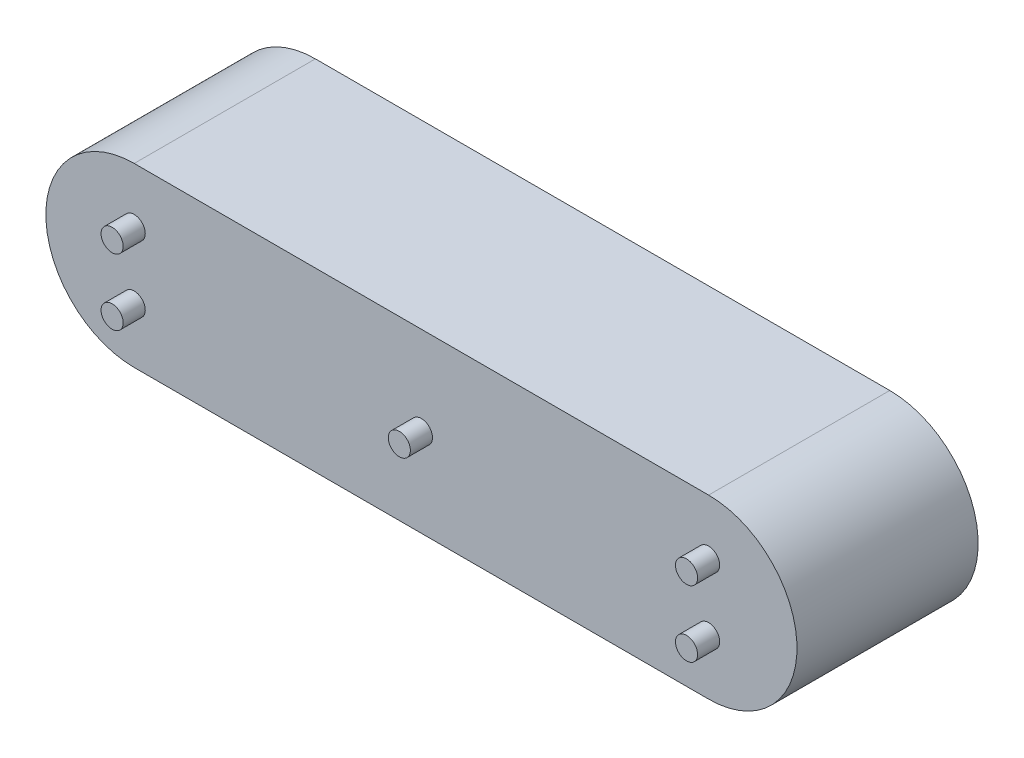
ISO-10303-21;
HEADER;
FILE_DESCRIPTION(('STEP AP214'),'2;1');
FILE_NAME('part.step','',(''),(''),'','','');
FILE_SCHEMA(('AUTOMOTIVE_DESIGN { 1 0 10303 214 1 1 1 1 }'));
ENDSEC;
DATA;
#1=APPLICATION_CONTEXT('core data for automotive mechanical design processes');
#2=APPLICATION_PROTOCOL_DEFINITION('international standard','automotive_design',2000,#1);
#3=PRODUCT_CONTEXT('',#1,'mechanical');
#4=PRODUCT('Part','Part','',(#3));
#5=PRODUCT_RELATED_PRODUCT_CATEGORY('part','',(#4));
#6=PRODUCT_DEFINITION_FORMATION('','',#4);
#7=PRODUCT_DEFINITION_CONTEXT('part definition',#1,'design');
#8=PRODUCT_DEFINITION('design','',#6,#7);
#9=PRODUCT_DEFINITION_SHAPE('','',#8);
#10=(LENGTH_UNIT() NAMED_UNIT(*) SI_UNIT(.MILLI.,.METRE.));
#11=(NAMED_UNIT(*) PLANE_ANGLE_UNIT() SI_UNIT($,.RADIAN.));
#12=(NAMED_UNIT(*) SI_UNIT($,.STERADIAN.) SOLID_ANGLE_UNIT());
#13=UNCERTAINTY_MEASURE_WITH_UNIT(LENGTH_MEASURE(1.E-05),#10,'distance_accuracy_value','');
#14=(GEOMETRIC_REPRESENTATION_CONTEXT(3) GLOBAL_UNCERTAINTY_ASSIGNED_CONTEXT((#13)) GLOBAL_UNIT_ASSIGNED_CONTEXT((#10,
#11,#12)) REPRESENTATION_CONTEXT('',''));
#15=CARTESIAN_POINT('',(0.,0.,0.));
#16=DIRECTION('',(0.,0.,1.));
#17=DIRECTION('',(1.,0.,0.));
#18=AXIS2_PLACEMENT_3D('',#15,#16,#17);
#19=CARTESIAN_POINT('',(0.,0.,-46.));
#20=DIRECTION('',(0.,0.,1.));
#21=DIRECTION('',(1.,0.,0.));
#22=AXIS2_PLACEMENT_3D('',#19,#20,#21);
#23=CYLINDRICAL_SURFACE('',#22,2.5);
#24=CARTESIAN_POINT('',(0.,0.,-46.));
#25=DIRECTION('',(0.,0.,1.));
#26=DIRECTION('',(1.,0.,0.));
#27=AXIS2_PLACEMENT_3D('',#24,#25,#26);
#28=CIRCLE('',#27,2.5);
#29=CARTESIAN_POINT('',(2.5,0.,-46.));
#30=VERTEX_POINT('',#29);
#31=EDGE_CURVE('E119',#30,#30,#28,.T.);
#32=ORIENTED_EDGE('',*,*,#31,.T.);
#33=EDGE_LOOP('',(#32));
#34=FACE_BOUND('',#33,.T.);
#35=CARTESIAN_POINT('',(0.,0.,-41.));
#36=DIRECTION('',(0.,0.,1.));
#37=DIRECTION('',(1.,0.,0.));
#38=AXIS2_PLACEMENT_3D('',#35,#36,#37);
#39=CIRCLE('',#38,2.5);
#40=CARTESIAN_POINT('',(2.5,0.,-41.));
#41=VERTEX_POINT('',#40);
#42=EDGE_CURVE('E113',#41,#41,#39,.F.);
#43=ORIENTED_EDGE('',*,*,#42,.T.);
#44=EDGE_LOOP('',(#43));
#45=FACE_BOUND('',#44,.T.);
#46=ADVANCED_FACE('F34',(#34,#45),#23,.T.);
#47=CARTESIAN_POINT('',(0.,0.,-46.));
#48=DIRECTION('',(0.,0.,1.));
#49=DIRECTION('',(1.,0.,0.));
#50=AXIS2_PLACEMENT_3D('',#47,#48,#49);
#51=PLANE('',#50);
#52=ORIENTED_EDGE('',*,*,#31,.F.);
#53=EDGE_LOOP('',(#52));
#54=FACE_BOUND('',#53,.T.);
#55=ADVANCED_FACE('F159',(#54),#51,.F.);
#56=CARTESIAN_POINT('',(-130.,7.49999999999999,-41.));
#57=DIRECTION('',(0.,0.,1.));
#58=DIRECTION('',(1.,0.,0.));
#59=AXIS2_PLACEMENT_3D('',#56,#57,#58);
#60=CYLINDRICAL_SURFACE('',#59,20.);
#61=CARTESIAN_POINT('',(-130.,7.49999999999999,0.));
#62=DIRECTION('',(0.,0.,1.));
#63=DIRECTION('',(1.,0.,0.));
#64=AXIS2_PLACEMENT_3D('',#61,#62,#63);
#65=CIRCLE('',#64,20.);
#66=CARTESIAN_POINT('',(-130.,27.5,0.));
#67=VERTEX_POINT('',#66);
#68=CARTESIAN_POINT('',(-130.,-12.5,0.));
#69=VERTEX_POINT('',#68);
#70=EDGE_CURVE('E103',#67,#69,#65,.T.);
#71=ORIENTED_EDGE('',*,*,#70,.F.);
#72=DIRECTION('',(0.,0.,1.));
#73=VECTOR('',#72,1.);
#74=CARTESIAN_POINT('',(-130.,27.5,-41.));
#75=LINE('',#74,#73);
#76=CARTESIAN_POINT('',(-130.,27.5,-41.));
#77=VERTEX_POINT('',#76);
#78=EDGE_CURVE('E51',#77,#67,#75,.T.);
#79=ORIENTED_EDGE('',*,*,#78,.F.);
#80=CARTESIAN_POINT('',(-130.,7.49999999999999,-41.));
#81=DIRECTION('',(0.,0.,1.));
#82=DIRECTION('',(1.,0.,0.));
#83=AXIS2_PLACEMENT_3D('',#80,#81,#82);
#84=CIRCLE('',#83,20.);
#85=CARTESIAN_POINT('',(-130.,-12.5,-41.));
#86=VERTEX_POINT('',#85);
#87=EDGE_CURVE('E96',#77,#86,#84,.T.);
#88=ORIENTED_EDGE('',*,*,#87,.T.);
#89=DIRECTION('',(0.,0.,1.));
#90=VECTOR('',#89,1.);
#91=CARTESIAN_POINT('',(-130.,-12.5,-41.));
#92=LINE('',#91,#90);
#93=EDGE_CURVE('E79',#86,#69,#92,.T.);
#94=ORIENTED_EDGE('',*,*,#93,.T.);
#95=EDGE_LOOP('',(#71,#79,#88,#94));
#96=FACE_BOUND('',#95,.T.);
#97=ADVANCED_FACE('F150',(#96),#60,.T.);
#98=CARTESIAN_POINT('',(-130.,27.5,-41.));
#99=DIRECTION('',(0.,1.,0.));
#100=DIRECTION('',(-1.,0.,0.));
#101=AXIS2_PLACEMENT_3D('',#98,#99,#100);
#102=PLANE('',#101);
#103=DIRECTION('',(-1.,0.,0.));
#104=VECTOR('',#103,1.);
#105=CARTESIAN_POINT('',(-130.,27.5,0.));
#106=LINE('',#105,#104);
#107=CARTESIAN_POINT('',(0.,27.5,0.));
#108=VERTEX_POINT('',#107);
#109=EDGE_CURVE('E98',#108,#67,#106,.T.);
#110=ORIENTED_EDGE('',*,*,#109,.F.);
#111=DIRECTION('',(0.,0.,1.));
#112=VECTOR('',#111,1.);
#113=CARTESIAN_POINT('',(0.,27.5,-41.));
#114=LINE('',#113,#112);
#115=CARTESIAN_POINT('',(0.,27.5,-41.));
#116=VERTEX_POINT('',#115);
#117=EDGE_CURVE('E68',#116,#108,#114,.T.);
#118=ORIENTED_EDGE('',*,*,#117,.F.);
#119=DIRECTION('',(-1.,0.,0.));
#120=VECTOR('',#119,1.);
#121=CARTESIAN_POINT('',(-130.,27.5,-41.));
#122=LINE('',#121,#120);
#123=EDGE_CURVE('E93',#116,#77,#122,.T.);
#124=ORIENTED_EDGE('',*,*,#123,.T.);
#125=ORIENTED_EDGE('',*,*,#78,.T.);
#126=EDGE_LOOP('',(#110,#118,#124,#125));
#127=FACE_BOUND('',#126,.T.);
#128=ADVANCED_FACE('F151',(#127),#102,.T.);
#129=CARTESIAN_POINT('',(0.,7.50000000000002,-41.));
#130=DIRECTION('',(0.,0.,1.));
#131=DIRECTION('',(1.,0.,0.));
#132=AXIS2_PLACEMENT_3D('',#129,#130,#131);
#133=CYLINDRICAL_SURFACE('',#132,20.);
#134=CARTESIAN_POINT('',(0.,7.50000000000002,0.));
#135=DIRECTION('',(0.,0.,1.));
#136=DIRECTION('',(1.,0.,0.));
#137=AXIS2_PLACEMENT_3D('',#134,#135,#136);
#138=CIRCLE('',#137,20.);
#139=CARTESIAN_POINT('',(0.,-12.5,0.));
#140=VERTEX_POINT('',#139);
#141=EDGE_CURVE('E87',#140,#108,#138,.T.);
#142=ORIENTED_EDGE('',*,*,#141,.F.);
#143=DIRECTION('',(0.,0.,1.));
#144=VECTOR('',#143,1.);
#145=CARTESIAN_POINT('',(0.,-12.5,-41.));
#146=LINE('',#145,#144);
#147=CARTESIAN_POINT('',(0.,-12.5,-41.));
#148=VERTEX_POINT('',#147);
#149=EDGE_CURVE('E82',#148,#140,#146,.T.);
#150=ORIENTED_EDGE('',*,*,#149,.F.);
#151=CARTESIAN_POINT('',(0.,7.50000000000002,-41.));
#152=DIRECTION('',(0.,0.,1.));
#153=DIRECTION('',(1.,0.,0.));
#154=AXIS2_PLACEMENT_3D('',#151,#152,#153);
#155=CIRCLE('',#154,20.);
#156=EDGE_CURVE('E85',#148,#116,#155,.T.);
#157=ORIENTED_EDGE('',*,*,#156,.T.);
#158=ORIENTED_EDGE('',*,*,#117,.T.);
#159=EDGE_LOOP('',(#142,#150,#157,#158));
#160=FACE_BOUND('',#159,.T.);
#161=ADVANCED_FACE('F84',(#160),#133,.T.);
#162=CARTESIAN_POINT('',(-130.,-12.5,-41.));
#163=DIRECTION('',(0.,-1.,0.));
#164=DIRECTION('',(1.,0.,0.));
#165=AXIS2_PLACEMENT_3D('',#162,#163,#164);
#166=PLANE('',#165);
#167=DIRECTION('',(1.,0.,0.));
#168=VECTOR('',#167,1.);
#169=CARTESIAN_POINT('',(-130.,-12.5,0.));
#170=LINE('',#169,#168);
#171=EDGE_CURVE('E106',#69,#140,#170,.T.);
#172=ORIENTED_EDGE('',*,*,#171,.F.);
#173=ORIENTED_EDGE('',*,*,#93,.F.);
#174=DIRECTION('',(1.,0.,0.));
#175=VECTOR('',#174,1.);
#176=CARTESIAN_POINT('',(-130.,-12.5,-41.));
#177=LINE('',#176,#175);
#178=EDGE_CURVE('E92',#86,#148,#177,.T.);
#179=ORIENTED_EDGE('',*,*,#178,.T.);
#180=ORIENTED_EDGE('',*,*,#149,.T.);
#181=EDGE_LOOP('',(#172,#173,#179,#180));
#182=FACE_BOUND('',#181,.T.);
#183=ADVANCED_FACE('F95',(#182),#166,.T.);
#184=CARTESIAN_POINT('',(-130.,7.49999999999999,-41.));
#185=DIRECTION('',(0.,0.,1.));
#186=DIRECTION('',(1.,0.,0.));
#187=AXIS2_PLACEMENT_3D('',#184,#185,#186);
#188=PLANE('',#187);
#189=CARTESIAN_POINT('',(-65.,7.49999999999999,-41.));
#190=DIRECTION('',(0.,0.,1.));
#191=DIRECTION('',(1.,0.,0.));
#192=AXIS2_PLACEMENT_3D('',#189,#190,#191);
#193=CIRCLE('',#192,2.50000000000001);
#194=CARTESIAN_POINT('',(-62.5,7.49999999999999,-41.));
#195=VERTEX_POINT('',#194);
#196=EDGE_CURVE('E249',#195,#195,#193,.T.);
#197=ORIENTED_EDGE('',*,*,#196,.T.);
#198=EDGE_LOOP('',(#197));
#199=FACE_BOUND('',#198,.T.);
#200=CARTESIAN_POINT('',(-130.,0.,-41.));
#201=DIRECTION('',(0.,0.,1.));
#202=DIRECTION('',(1.,0.,0.));
#203=AXIS2_PLACEMENT_3D('',#200,#201,#202);
#204=CIRCLE('',#203,2.5);
#205=CARTESIAN_POINT('',(-127.5,0.,-41.));
#206=VERTEX_POINT('',#205);
#207=EDGE_CURVE('E259',#206,#206,#204,.T.);
#208=ORIENTED_EDGE('',*,*,#207,.T.);
#209=EDGE_LOOP('',(#208));
#210=FACE_BOUND('',#209,.T.);
#211=CARTESIAN_POINT('',(-130.,15.,-41.));
#212=DIRECTION('',(0.,0.,1.));
#213=DIRECTION('',(1.,0.,0.));
#214=AXIS2_PLACEMENT_3D('',#211,#212,#213);
#215=CIRCLE('',#214,2.5);
#216=CARTESIAN_POINT('',(-127.5,15.,-41.));
#217=VERTEX_POINT('',#216);
#218=EDGE_CURVE('E268',#217,#217,#215,.T.);
#219=ORIENTED_EDGE('',*,*,#218,.T.);
#220=EDGE_LOOP('',(#219));
#221=FACE_BOUND('',#220,.T.);
#222=CARTESIAN_POINT('',(0.,15.,-41.));
#223=DIRECTION('',(0.,0.,1.));
#224=DIRECTION('',(1.,0.,0.));
#225=AXIS2_PLACEMENT_3D('',#222,#223,#224);
#226=CIRCLE('',#225,2.5);
#227=CARTESIAN_POINT('',(2.5,15.,-41.));
#228=VERTEX_POINT('',#227);
#229=EDGE_CURVE('E107',#228,#228,#226,.T.);
#230=ORIENTED_EDGE('',*,*,#229,.T.);
#231=EDGE_LOOP('',(#230));
#232=FACE_BOUND('',#231,.T.);
#233=ORIENTED_EDGE('',*,*,#42,.F.);
#234=EDGE_LOOP('',(#233));
#235=FACE_BOUND('',#234,.T.);
#236=ORIENTED_EDGE('',*,*,#87,.F.);
#237=ORIENTED_EDGE('',*,*,#123,.F.);
#238=ORIENTED_EDGE('',*,*,#156,.F.);
#239=ORIENTED_EDGE('',*,*,#178,.F.);
#240=EDGE_LOOP('',(#236,#237,#238,#239));
#241=FACE_BOUND('',#240,.T.);
#242=ADVANCED_FACE('F91',(#199,#210,#221,#232,#235,#241),#188,.F.);
#243=CARTESIAN_POINT('',(-130.,7.49999999999999,0.));
#244=DIRECTION('',(0.,0.,1.));
#245=DIRECTION('',(1.,0.,0.));
#246=AXIS2_PLACEMENT_3D('',#243,#244,#245);
#247=PLANE('',#246);
#248=CARTESIAN_POINT('',(-65.,7.49999999999999,0.));
#249=DIRECTION('',(0.,0.,1.));
#250=DIRECTION('',(1.,0.,0.));
#251=AXIS2_PLACEMENT_3D('',#248,#249,#250);
#252=CIRCLE('',#251,2.50000000000001);
#253=CARTESIAN_POINT('',(-62.5,7.49999999999999,0.));
#254=VERTEX_POINT('',#253);
#255=EDGE_CURVE('E11',#254,#254,#252,.T.);
#256=ORIENTED_EDGE('',*,*,#255,.F.);
#257=EDGE_LOOP('',(#256));
#258=FACE_BOUND('',#257,.T.);
#259=CARTESIAN_POINT('',(-130.,0.,0.));
#260=DIRECTION('',(0.,0.,1.));
#261=DIRECTION('',(1.,0.,0.));
#262=AXIS2_PLACEMENT_3D('',#259,#260,#261);
#263=CIRCLE('',#262,2.5);
#264=CARTESIAN_POINT('',(-127.5,0.,0.));
#265=VERTEX_POINT('',#264);
#266=EDGE_CURVE('E43',#265,#265,#263,.T.);
#267=ORIENTED_EDGE('',*,*,#266,.F.);
#268=EDGE_LOOP('',(#267));
#269=FACE_BOUND('',#268,.T.);
#270=CARTESIAN_POINT('',(-130.,15.,0.));
#271=DIRECTION('',(0.,0.,1.));
#272=DIRECTION('',(1.,0.,0.));
#273=AXIS2_PLACEMENT_3D('',#270,#271,#272);
#274=CIRCLE('',#273,2.5);
#275=CARTESIAN_POINT('',(-127.5,15.,0.));
#276=VERTEX_POINT('',#275);
#277=EDGE_CURVE('E130',#276,#276,#274,.T.);
#278=ORIENTED_EDGE('',*,*,#277,.F.);
#279=EDGE_LOOP('',(#278));
#280=FACE_BOUND('',#279,.T.);
#281=CARTESIAN_POINT('',(0.,15.,0.));
#282=DIRECTION('',(0.,0.,1.));
#283=DIRECTION('',(1.,0.,0.));
#284=AXIS2_PLACEMENT_3D('',#281,#282,#283);
#285=CIRCLE('',#284,2.5);
#286=CARTESIAN_POINT('',(2.5,15.,0.));
#287=VERTEX_POINT('',#286);
#288=EDGE_CURVE('E125',#287,#287,#285,.T.);
#289=ORIENTED_EDGE('',*,*,#288,.F.);
#290=EDGE_LOOP('',(#289));
#291=FACE_BOUND('',#290,.T.);
#292=CARTESIAN_POINT('',(0.,0.,0.));
#293=DIRECTION('',(0.,0.,1.));
#294=DIRECTION('',(1.,0.,0.));
#295=AXIS2_PLACEMENT_3D('',#292,#293,#294);
#296=CIRCLE('',#295,2.5);
#297=CARTESIAN_POINT('',(2.5,0.,0.));
#298=VERTEX_POINT('',#297);
#299=EDGE_CURVE('E122',#298,#298,#296,.F.);
#300=ORIENTED_EDGE('',*,*,#299,.T.);
#301=EDGE_LOOP('',(#300));
#302=FACE_BOUND('',#301,.T.);
#303=ORIENTED_EDGE('',*,*,#70,.T.);
#304=ORIENTED_EDGE('',*,*,#171,.T.);
#305=ORIENTED_EDGE('',*,*,#141,.T.);
#306=ORIENTED_EDGE('',*,*,#109,.T.);
#307=EDGE_LOOP('',(#303,#304,#305,#306));
#308=FACE_BOUND('',#307,.T.);
#309=ADVANCED_FACE('F138',(#258,#269,#280,#291,#302,#308),#247,.T.);
#310=CARTESIAN_POINT('',(0.,0.,5.));
#311=DIRECTION('',(0.,0.,1.));
#312=DIRECTION('',(1.,0.,0.));
#313=AXIS2_PLACEMENT_3D('',#310,#311,#312);
#314=PLANE('',#313);
#315=CARTESIAN_POINT('',(0.,0.,5.));
#316=DIRECTION('',(0.,0.,1.));
#317=DIRECTION('',(1.,0.,0.));
#318=AXIS2_PLACEMENT_3D('',#315,#316,#317);
#319=CIRCLE('',#318,2.5);
#320=CARTESIAN_POINT('',(2.5,0.,5.));
#321=VERTEX_POINT('',#320);
#322=EDGE_CURVE('E116',#321,#321,#319,.T.);
#323=ORIENTED_EDGE('',*,*,#322,.T.);
#324=EDGE_LOOP('',(#323));
#325=FACE_BOUND('',#324,.T.);
#326=ADVANCED_FACE('F141',(#325),#314,.T.);
#327=ORIENTED_EDGE('',*,*,#299,.F.);
#328=EDGE_LOOP('',(#327));
#329=FACE_BOUND('',#328,.T.);
#330=ORIENTED_EDGE('',*,*,#322,.F.);
#331=EDGE_LOOP('',(#330));
#332=FACE_BOUND('',#331,.T.);
#333=ADVANCED_FACE('F36',(#329,#332),#23,.T.);
#334=CARTESIAN_POINT('',(0.,15.,5.));
#335=DIRECTION('',(0.,0.,1.));
#336=DIRECTION('',(1.,0.,0.));
#337=AXIS2_PLACEMENT_3D('',#334,#335,#336);
#338=PLANE('',#337);
#339=CARTESIAN_POINT('',(0.,15.,5.));
#340=DIRECTION('',(0.,0.,1.));
#341=DIRECTION('',(1.,0.,0.));
#342=AXIS2_PLACEMENT_3D('',#339,#340,#341);
#343=CIRCLE('',#342,2.5);
#344=CARTESIAN_POINT('',(2.5,15.,5.));
#345=VERTEX_POINT('',#344);
#346=EDGE_CURVE('E271',#345,#345,#343,.T.);
#347=ORIENTED_EDGE('',*,*,#346,.T.);
#348=EDGE_LOOP('',(#347));
#349=FACE_BOUND('',#348,.T.);
#350=ADVANCED_FACE('F169',(#349),#338,.T.);
#351=CARTESIAN_POINT('',(0.,15.,-46.));
#352=DIRECTION('',(0.,0.,1.));
#353=DIRECTION('',(1.,0.,0.));
#354=AXIS2_PLACEMENT_3D('',#351,#352,#353);
#355=CYLINDRICAL_SURFACE('',#354,2.5);
#356=ORIENTED_EDGE('',*,*,#288,.T.);
#357=EDGE_LOOP('',(#356));
#358=FACE_BOUND('',#357,.T.);
#359=ORIENTED_EDGE('',*,*,#346,.F.);
#360=EDGE_LOOP('',(#359));
#361=FACE_BOUND('',#360,.T.);
#362=ADVANCED_FACE('F175',(#358,#361),#355,.T.);
#363=CARTESIAN_POINT('',(0.,15.,-46.));
#364=DIRECTION('',(0.,0.,1.));
#365=DIRECTION('',(1.,0.,0.));
#366=AXIS2_PLACEMENT_3D('',#363,#364,#365);
#367=CIRCLE('',#366,2.5);
#368=CARTESIAN_POINT('',(2.5,15.,-46.));
#369=VERTEX_POINT('',#368);
#370=EDGE_CURVE('E274',#369,#369,#367,.T.);
#371=ORIENTED_EDGE('',*,*,#370,.T.);
#372=EDGE_LOOP('',(#371));
#373=FACE_BOUND('',#372,.T.);
#374=ORIENTED_EDGE('',*,*,#229,.F.);
#375=EDGE_LOOP('',(#374));
#376=FACE_BOUND('',#375,.T.);
#377=ADVANCED_FACE('F198',(#373,#376),#355,.T.);
#378=CARTESIAN_POINT('',(0.,15.,-46.));
#379=DIRECTION('',(0.,0.,1.));
#380=DIRECTION('',(1.,0.,0.));
#381=AXIS2_PLACEMENT_3D('',#378,#379,#380);
#382=PLANE('',#381);
#383=ORIENTED_EDGE('',*,*,#370,.F.);
#384=EDGE_LOOP('',(#383));
#385=FACE_BOUND('',#384,.T.);
#386=ADVANCED_FACE('F200',(#385),#382,.F.);
#387=CARTESIAN_POINT('',(-130.,15.,5.));
#388=DIRECTION('',(0.,0.,1.));
#389=DIRECTION('',(1.,0.,0.));
#390=AXIS2_PLACEMENT_3D('',#387,#388,#389);
#391=PLANE('',#390);
#392=CARTESIAN_POINT('',(-130.,15.,5.));
#393=DIRECTION('',(0.,0.,1.));
#394=DIRECTION('',(1.,0.,0.));
#395=AXIS2_PLACEMENT_3D('',#392,#393,#394);
#396=CIRCLE('',#395,2.5);
#397=CARTESIAN_POINT('',(-127.5,15.,5.));
#398=VERTEX_POINT('',#397);
#399=EDGE_CURVE('E262',#398,#398,#396,.T.);
#400=ORIENTED_EDGE('',*,*,#399,.T.);
#401=EDGE_LOOP('',(#400));
#402=FACE_BOUND('',#401,.T.);
#403=ADVANCED_FACE('F202',(#402),#391,.T.);
#404=CARTESIAN_POINT('',(-130.,15.,-46.));
#405=DIRECTION('',(0.,0.,1.));
#406=DIRECTION('',(1.,0.,0.));
#407=AXIS2_PLACEMENT_3D('',#404,#405,#406);
#408=CYLINDRICAL_SURFACE('',#407,2.5);
#409=ORIENTED_EDGE('',*,*,#277,.T.);
#410=EDGE_LOOP('',(#409));
#411=FACE_BOUND('',#410,.T.);
#412=ORIENTED_EDGE('',*,*,#399,.F.);
#413=EDGE_LOOP('',(#412));
#414=FACE_BOUND('',#413,.T.);
#415=ADVANCED_FACE('F205',(#411,#414),#408,.T.);
#416=CARTESIAN_POINT('',(-130.,15.,-46.));
#417=DIRECTION('',(0.,0.,1.));
#418=DIRECTION('',(1.,0.,0.));
#419=AXIS2_PLACEMENT_3D('',#416,#417,#418);
#420=CIRCLE('',#419,2.5);
#421=CARTESIAN_POINT('',(-127.5,15.,-46.));
#422=VERTEX_POINT('',#421);
#423=EDGE_CURVE('E265',#422,#422,#420,.T.);
#424=ORIENTED_EDGE('',*,*,#423,.T.);
#425=EDGE_LOOP('',(#424));
#426=FACE_BOUND('',#425,.T.);
#427=ORIENTED_EDGE('',*,*,#218,.F.);
#428=EDGE_LOOP('',(#427));
#429=FACE_BOUND('',#428,.T.);
#430=ADVANCED_FACE('F208',(#426,#429),#408,.T.);
#431=CARTESIAN_POINT('',(-130.,15.,-46.));
#432=DIRECTION('',(0.,0.,1.));
#433=DIRECTION('',(1.,0.,0.));
#434=AXIS2_PLACEMENT_3D('',#431,#432,#433);
#435=PLANE('',#434);
#436=ORIENTED_EDGE('',*,*,#423,.F.);
#437=EDGE_LOOP('',(#436));
#438=FACE_BOUND('',#437,.T.);
#439=ADVANCED_FACE('F210',(#438),#435,.F.);
#440=CARTESIAN_POINT('',(-130.,0.,5.));
#441=DIRECTION('',(0.,0.,1.));
#442=DIRECTION('',(1.,0.,0.));
#443=AXIS2_PLACEMENT_3D('',#440,#441,#442);
#444=PLANE('',#443);
#445=CARTESIAN_POINT('',(-130.,0.,5.));
#446=DIRECTION('',(0.,0.,1.));
#447=DIRECTION('',(1.,0.,0.));
#448=AXIS2_PLACEMENT_3D('',#445,#446,#447);
#449=CIRCLE('',#448,2.5);
#450=CARTESIAN_POINT('',(-127.5,0.,5.));
#451=VERTEX_POINT('',#450);
#452=EDGE_CURVE('E253',#451,#451,#449,.T.);
#453=ORIENTED_EDGE('',*,*,#452,.T.);
#454=EDGE_LOOP('',(#453));
#455=FACE_BOUND('',#454,.T.);
#456=ADVANCED_FACE('F213',(#455),#444,.T.);
#457=CARTESIAN_POINT('',(-130.,0.,-46.));
#458=DIRECTION('',(0.,0.,1.));
#459=DIRECTION('',(1.,0.,0.));
#460=AXIS2_PLACEMENT_3D('',#457,#458,#459);
#461=CYLINDRICAL_SURFACE('',#460,2.5);
#462=ORIENTED_EDGE('',*,*,#266,.T.);
#463=EDGE_LOOP('',(#462));
#464=FACE_BOUND('',#463,.T.);
#465=ORIENTED_EDGE('',*,*,#452,.F.);
#466=EDGE_LOOP('',(#465));
#467=FACE_BOUND('',#466,.T.);
#468=ADVANCED_FACE('F135',(#464,#467),#461,.T.);
#469=CARTESIAN_POINT('',(-130.,0.,-46.));
#470=DIRECTION('',(0.,0.,1.));
#471=DIRECTION('',(1.,0.,0.));
#472=AXIS2_PLACEMENT_3D('',#469,#470,#471);
#473=CIRCLE('',#472,2.5);
#474=CARTESIAN_POINT('',(-127.5,0.,-46.));
#475=VERTEX_POINT('',#474);
#476=EDGE_CURVE('E256',#475,#475,#473,.T.);
#477=ORIENTED_EDGE('',*,*,#476,.T.);
#478=EDGE_LOOP('',(#477));
#479=FACE_BOUND('',#478,.T.);
#480=ORIENTED_EDGE('',*,*,#207,.F.);
#481=EDGE_LOOP('',(#480));
#482=FACE_BOUND('',#481,.T.);
#483=ADVANCED_FACE('F220',(#479,#482),#461,.T.);
#484=CARTESIAN_POINT('',(-130.,0.,-46.));
#485=DIRECTION('',(0.,0.,1.));
#486=DIRECTION('',(1.,0.,0.));
#487=AXIS2_PLACEMENT_3D('',#484,#485,#486);
#488=PLANE('',#487);
#489=ORIENTED_EDGE('',*,*,#476,.F.);
#490=EDGE_LOOP('',(#489));
#491=FACE_BOUND('',#490,.T.);
#492=ADVANCED_FACE('F221',(#491),#488,.F.);
#493=CARTESIAN_POINT('',(-65.,7.49999999999999,5.));
#494=DIRECTION('',(0.,0.,1.));
#495=DIRECTION('',(1.,0.,0.));
#496=AXIS2_PLACEMENT_3D('',#493,#494,#495);
#497=PLANE('',#496);
#498=CARTESIAN_POINT('',(-65.,7.49999999999999,5.));
#499=DIRECTION('',(0.,0.,1.));
#500=DIRECTION('',(1.,0.,0.));
#501=AXIS2_PLACEMENT_3D('',#498,#499,#500);
#502=CIRCLE('',#501,2.50000000000001);
#503=CARTESIAN_POINT('',(-62.5,7.49999999999999,5.));
#504=VERTEX_POINT('',#503);
#505=EDGE_CURVE('E244',#504,#504,#502,.T.);
#506=ORIENTED_EDGE('',*,*,#505,.T.);
#507=EDGE_LOOP('',(#506));
#508=FACE_BOUND('',#507,.T.);
#509=ADVANCED_FACE('F224',(#508),#497,.T.);
#510=CARTESIAN_POINT('',(-65.,7.49999999999999,-46.));
#511=DIRECTION('',(0.,0.,1.));
#512=DIRECTION('',(1.,0.,0.));
#513=AXIS2_PLACEMENT_3D('',#510,#511,#512);
#514=CYLINDRICAL_SURFACE('',#513,2.50000000000001);
#515=ORIENTED_EDGE('',*,*,#255,.T.);
#516=EDGE_LOOP('',(#515));
#517=FACE_BOUND('',#516,.T.);
#518=ORIENTED_EDGE('',*,*,#505,.F.);
#519=EDGE_LOOP('',(#518));
#520=FACE_BOUND('',#519,.T.);
#521=ADVANCED_FACE('F229',(#517,#520),#514,.T.);
#522=CARTESIAN_POINT('',(-65.,7.49999999999999,-46.));
#523=DIRECTION('',(0.,0.,1.));
#524=DIRECTION('',(1.,0.,0.));
#525=AXIS2_PLACEMENT_3D('',#522,#523,#524);
#526=CIRCLE('',#525,2.50000000000001);
#527=CARTESIAN_POINT('',(-62.5,7.49999999999999,-46.));
#528=VERTEX_POINT('',#527);
#529=EDGE_CURVE('E246',#528,#528,#526,.T.);
#530=ORIENTED_EDGE('',*,*,#529,.T.);
#531=EDGE_LOOP('',(#530));
#532=FACE_BOUND('',#531,.T.);
#533=ORIENTED_EDGE('',*,*,#196,.F.);
#534=EDGE_LOOP('',(#533));
#535=FACE_BOUND('',#534,.T.);
#536=ADVANCED_FACE('F232',(#532,#535),#514,.T.);
#537=CARTESIAN_POINT('',(-65.,7.49999999999999,-46.));
#538=DIRECTION('',(0.,0.,1.));
#539=DIRECTION('',(1.,0.,0.));
#540=AXIS2_PLACEMENT_3D('',#537,#538,#539);
#541=PLANE('',#540);
#542=ORIENTED_EDGE('',*,*,#529,.F.);
#543=EDGE_LOOP('',(#542));
#544=FACE_BOUND('',#543,.T.);
#545=ADVANCED_FACE('F234',(#544),#541,.F.);
#546=CLOSED_SHELL('',(#46,#55,#97,#128,#161,#183,#242,#309,#326,#333,#350,#362,#377,#386,#403,
#415,#430,#439,#456,#468,#483,#492,#509,#521,#536,#545));
#547=MANIFOLD_SOLID_BREP('B2',#546);
#548=ADVANCED_BREP_SHAPE_REPRESENTATION('',(#18,#547),#14);
#549=SHAPE_DEFINITION_REPRESENTATION(#9,#548);
ENDSEC;
END-ISO-10303-21;
